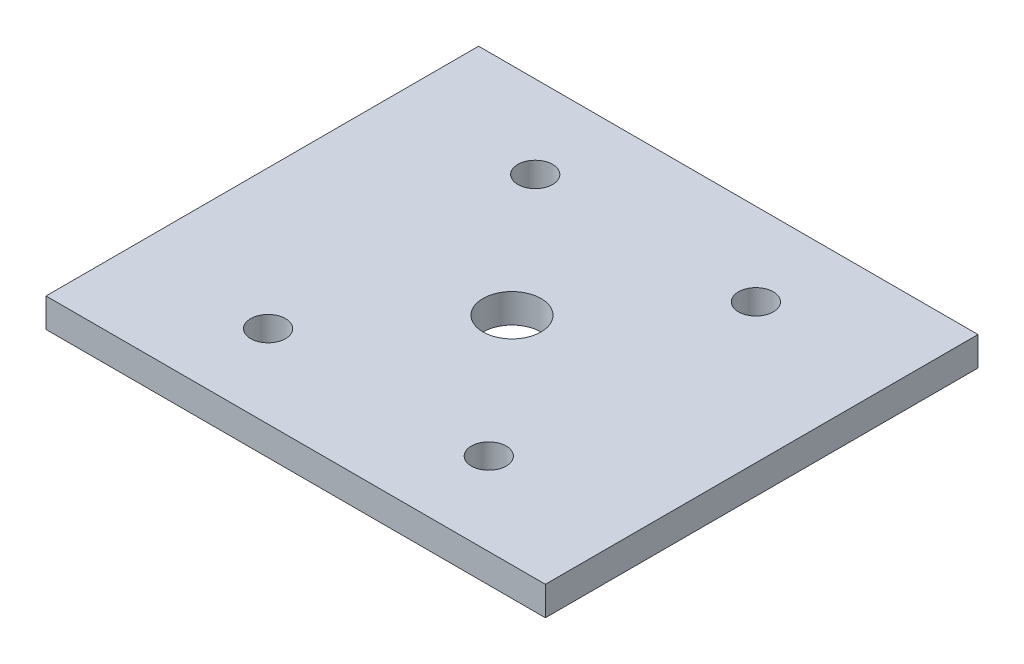
ISO-10303-21;
HEADER;
FILE_DESCRIPTION(('STEP AP214'),'2;1');
FILE_NAME('part.step','',(''),(''),'','','');
FILE_SCHEMA(('AUTOMOTIVE_DESIGN { 1 0 10303 214 1 1 1 1 }'));
ENDSEC;
DATA;
#1=APPLICATION_CONTEXT('core data for automotive mechanical design processes');
#2=APPLICATION_PROTOCOL_DEFINITION('international standard','automotive_design',2000,#1);
#3=PRODUCT_CONTEXT('',#1,'mechanical');
#4=PRODUCT('Part','Part','',(#3));
#5=PRODUCT_RELATED_PRODUCT_CATEGORY('part','',(#4));
#6=PRODUCT_DEFINITION_FORMATION('','',#4);
#7=PRODUCT_DEFINITION_CONTEXT('part definition',#1,'design');
#8=PRODUCT_DEFINITION('design','',#6,#7);
#9=PRODUCT_DEFINITION_SHAPE('','',#8);
#10=(LENGTH_UNIT() NAMED_UNIT(*) SI_UNIT(.MILLI.,.METRE.));
#11=(NAMED_UNIT(*) PLANE_ANGLE_UNIT() SI_UNIT($,.RADIAN.));
#12=(NAMED_UNIT(*) SI_UNIT($,.STERADIAN.) SOLID_ANGLE_UNIT());
#13=UNCERTAINTY_MEASURE_WITH_UNIT(LENGTH_MEASURE(1.E-05),#10,'distance_accuracy_value','');
#14=(GEOMETRIC_REPRESENTATION_CONTEXT(3) GLOBAL_UNCERTAINTY_ASSIGNED_CONTEXT((#13)) GLOBAL_UNIT_ASSIGNED_CONTEXT((#10,
#11,#12)) REPRESENTATION_CONTEXT('',''));
#15=CARTESIAN_POINT('',(0.,0.,0.));
#16=DIRECTION('',(0.,0.,1.));
#17=DIRECTION('',(1.,0.,0.));
#18=AXIS2_PLACEMENT_3D('',#15,#16,#17);
#19=CARTESIAN_POINT('',(0.,-10.,0.));
#20=DIRECTION('',(0.,-1.,0.));
#21=DIRECTION('',(0.,0.,-1.));
#22=AXIS2_PLACEMENT_3D('',#19,#20,#21);
#23=PLANE('',#22);
#24=CARTESIAN_POINT('',(85.0000000000001,-10.,-28.5000000000005));
#25=DIRECTION('',(0.,1.,0.));
#26=DIRECTION('',(0.,0.,1.));
#27=AXIS2_PLACEMENT_3D('',#24,#25,#26);
#28=CIRCLE('',#27,6.);
#29=CARTESIAN_POINT('',(85.0000000000001,-10.,-22.5000000000005));
#30=VERTEX_POINT('',#29);
#31=EDGE_CURVE('E170',#30,#30,#28,.F.);
#32=ORIENTED_EDGE('',*,*,#31,.F.);
#33=EDGE_LOOP('',(#32));
#34=FACE_BOUND('',#33,.T.);
#35=CARTESIAN_POINT('',(9.00000000000013,-10.,-120.5));
#36=DIRECTION('',(0.,1.,0.));
#37=DIRECTION('',(0.,0.,1.));
#38=AXIS2_PLACEMENT_3D('',#35,#36,#37);
#39=CIRCLE('',#38,6.00000000000001);
#40=CARTESIAN_POINT('',(9.00000000000013,-10.,-114.5));
#41=VERTEX_POINT('',#40);
#42=EDGE_CURVE('E113',#41,#41,#39,.F.);
#43=ORIENTED_EDGE('',*,*,#42,.F.);
#44=EDGE_LOOP('',(#43));
#45=FACE_BOUND('',#44,.T.);
#46=DIRECTION('',(0.,0.,1.));
#47=VECTOR('',#46,1.);
#48=CARTESIAN_POINT('',(-38.9999999999999,-10.,-4.71844785465692E-13));
#49=LINE('',#48,#47);
#50=CARTESIAN_POINT('',(-38.9999999999999,-10.,-149.));
#51=VERTEX_POINT('',#50);
#52=CARTESIAN_POINT('',(-38.9999999999999,-10.,-4.71844785465692E-13));
#53=VERTEX_POINT('',#52);
#54=EDGE_CURVE('E102',#51,#53,#49,.T.);
#55=ORIENTED_EDGE('',*,*,#54,.F.);
#56=DIRECTION('',(-1.,0.,0.));
#57=VECTOR('',#56,1.);
#58=CARTESIAN_POINT('',(-38.9999999999999,-10.,-149.));
#59=LINE('',#58,#57);
#60=CARTESIAN_POINT('',(133.,-10.,-149.));
#61=VERTEX_POINT('',#60);
#62=EDGE_CURVE('E99',#61,#51,#59,.T.);
#63=ORIENTED_EDGE('',*,*,#62,.F.);
#64=DIRECTION('',(0.,0.,-1.));
#65=VECTOR('',#64,1.);
#66=CARTESIAN_POINT('',(133.,-10.,-3.60822483003176E-13));
#67=LINE('',#66,#65);
#68=CARTESIAN_POINT('',(133.,-10.,-3.60822483003176E-13));
#69=VERTEX_POINT('',#68);
#70=EDGE_CURVE('E92',#69,#61,#67,.T.);
#71=ORIENTED_EDGE('',*,*,#70,.F.);
#72=DIRECTION('',(1.,0.,0.));
#73=VECTOR('',#72,1.);
#74=CARTESIAN_POINT('',(-38.9999999999999,-10.,-4.71844785465692E-13));
#75=LINE('',#74,#73);
#76=EDGE_CURVE('E98',#53,#69,#75,.T.);
#77=ORIENTED_EDGE('',*,*,#76,.F.);
#78=EDGE_LOOP('',(#55,#63,#71,#77));
#79=FACE_BOUND('',#78,.T.);
#80=CARTESIAN_POINT('',(47.0000000000001,-10.,-74.5000000000004));
#81=DIRECTION('',(0.,1.,0.));
#82=DIRECTION('',(0.,0.,1.));
#83=AXIS2_PLACEMENT_3D('',#80,#81,#82);
#84=CIRCLE('',#83,10.);
#85=CARTESIAN_POINT('',(47.0000000000001,-10.,-64.5000000000004));
#86=VERTEX_POINT('',#85);
#87=EDGE_CURVE('E165',#86,#86,#84,.T.);
#88=ORIENTED_EDGE('',*,*,#87,.T.);
#89=EDGE_LOOP('',(#88));
#90=FACE_BOUND('',#89,.T.);
#91=CARTESIAN_POINT('',(9.0000000000001,-10.,-28.5000000000006));
#92=DIRECTION('',(0.,1.,0.));
#93=DIRECTION('',(0.,0.,1.));
#94=AXIS2_PLACEMENT_3D('',#91,#92,#93);
#95=CIRCLE('',#94,6.);
#96=CARTESIAN_POINT('',(9.0000000000001,-10.,-22.5000000000006));
#97=VERTEX_POINT('',#96);
#98=EDGE_CURVE('E187',#97,#97,#95,.T.);
#99=ORIENTED_EDGE('',*,*,#98,.T.);
#100=EDGE_LOOP('',(#99));
#101=FACE_BOUND('',#100,.T.);
#102=CARTESIAN_POINT('',(85.0000000000001,-10.,-120.5));
#103=DIRECTION('',(0.,1.,0.));
#104=DIRECTION('',(0.,0.,1.));
#105=AXIS2_PLACEMENT_3D('',#102,#103,#104);
#106=CIRCLE('',#105,6.);
#107=CARTESIAN_POINT('',(85.0000000000001,-10.,-114.5));
#108=VERTEX_POINT('',#107);
#109=EDGE_CURVE('E180',#108,#108,#106,.T.);
#110=ORIENTED_EDGE('',*,*,#109,.T.);
#111=EDGE_LOOP('',(#110));
#112=FACE_BOUND('',#111,.T.);
#113=ADVANCED_FACE('F43',(#34,#45,#79,#90,#101,#112),#23,.T.);
#114=CARTESIAN_POINT('',(0.,0.,0.));
#115=DIRECTION('',(0.,-1.,0.));
#116=DIRECTION('',(0.,0.,-1.));
#117=AXIS2_PLACEMENT_3D('',#114,#115,#116);
#118=PLANE('',#117);
#119=CARTESIAN_POINT('',(9.0000000000001,0.,-28.5000000000006));
#120=DIRECTION('',(0.,1.,0.));
#121=DIRECTION('',(0.,0.,1.));
#122=AXIS2_PLACEMENT_3D('',#119,#120,#121);
#123=CIRCLE('',#122,6.);
#124=CARTESIAN_POINT('',(9.0000000000001,0.,-22.5000000000006));
#125=VERTEX_POINT('',#124);
#126=EDGE_CURVE('E172',#125,#125,#123,.T.);
#127=ORIENTED_EDGE('',*,*,#126,.F.);
#128=EDGE_LOOP('',(#127));
#129=FACE_BOUND('',#128,.T.);
#130=DIRECTION('',(0.,0.,1.));
#131=VECTOR('',#130,1.);
#132=CARTESIAN_POINT('',(-38.9999999999999,0.,-4.71844785465692E-13));
#133=LINE('',#132,#131);
#134=CARTESIAN_POINT('',(-38.9999999999999,0.,-149.));
#135=VERTEX_POINT('',#134);
#136=CARTESIAN_POINT('',(-38.9999999999999,0.,-4.71844785465692E-13));
#137=VERTEX_POINT('',#136);
#138=EDGE_CURVE('E109',#135,#137,#133,.T.);
#139=ORIENTED_EDGE('',*,*,#138,.T.);
#140=DIRECTION('',(1.,0.,0.));
#141=VECTOR('',#140,1.);
#142=CARTESIAN_POINT('',(-38.9999999999999,0.,-4.71844785465692E-13));
#143=LINE('',#142,#141);
#144=CARTESIAN_POINT('',(133.,0.,-3.60822483003176E-13));
#145=VERTEX_POINT('',#144);
#146=EDGE_CURVE('E112',#137,#145,#143,.T.);
#147=ORIENTED_EDGE('',*,*,#146,.T.);
#148=DIRECTION('',(0.,0.,-1.));
#149=VECTOR('',#148,1.);
#150=CARTESIAN_POINT('',(133.,0.,-3.60822483003176E-13));
#151=LINE('',#150,#149);
#152=CARTESIAN_POINT('',(133.,0.,-149.));
#153=VERTEX_POINT('',#152);
#154=EDGE_CURVE('E94',#145,#153,#151,.T.);
#155=ORIENTED_EDGE('',*,*,#154,.T.);
#156=DIRECTION('',(-1.,0.,0.));
#157=VECTOR('',#156,1.);
#158=CARTESIAN_POINT('',(-38.9999999999999,0.,-149.));
#159=LINE('',#158,#157);
#160=EDGE_CURVE('E104',#153,#135,#159,.T.);
#161=ORIENTED_EDGE('',*,*,#160,.T.);
#162=EDGE_LOOP('',(#139,#147,#155,#161));
#163=FACE_BOUND('',#162,.T.);
#164=CARTESIAN_POINT('',(9.00000000000013,0.,-120.5));
#165=DIRECTION('',(0.,1.,0.));
#166=DIRECTION('',(0.,0.,1.));
#167=AXIS2_PLACEMENT_3D('',#164,#165,#166);
#168=CIRCLE('',#167,6.00000000000001);
#169=CARTESIAN_POINT('',(9.00000000000013,0.,-114.5));
#170=VERTEX_POINT('',#169);
#171=EDGE_CURVE('E183',#170,#170,#168,.F.);
#172=ORIENTED_EDGE('',*,*,#171,.T.);
#173=EDGE_LOOP('',(#172));
#174=FACE_BOUND('',#173,.T.);
#175=CARTESIAN_POINT('',(85.0000000000001,0.,-28.5000000000005));
#176=DIRECTION('',(0.,1.,0.));
#177=DIRECTION('',(0.,0.,1.));
#178=AXIS2_PLACEMENT_3D('',#175,#176,#177);
#179=CIRCLE('',#178,6.);
#180=CARTESIAN_POINT('',(85.0000000000001,0.,-22.5000000000005));
#181=VERTEX_POINT('',#180);
#182=EDGE_CURVE('E175',#181,#181,#179,.F.);
#183=ORIENTED_EDGE('',*,*,#182,.T.);
#184=EDGE_LOOP('',(#183));
#185=FACE_BOUND('',#184,.T.);
#186=CARTESIAN_POINT('',(47.0000000000001,0.,-74.5000000000004));
#187=DIRECTION('',(0.,1.,0.));
#188=DIRECTION('',(0.,0.,1.));
#189=AXIS2_PLACEMENT_3D('',#186,#187,#188);
#190=CIRCLE('',#189,10.);
#191=CARTESIAN_POINT('',(47.0000000000001,0.,-64.5000000000004));
#192=VERTEX_POINT('',#191);
#193=EDGE_CURVE('E168',#192,#192,#190,.T.);
#194=ORIENTED_EDGE('',*,*,#193,.F.);
#195=EDGE_LOOP('',(#194));
#196=FACE_BOUND('',#195,.T.);
#197=CARTESIAN_POINT('',(85.0000000000001,0.,-120.5));
#198=DIRECTION('',(0.,1.,0.));
#199=DIRECTION('',(0.,0.,1.));
#200=AXIS2_PLACEMENT_3D('',#197,#198,#199);
#201=CIRCLE('',#200,6.);
#202=CARTESIAN_POINT('',(85.0000000000001,0.,-114.5));
#203=VERTEX_POINT('',#202);
#204=EDGE_CURVE('E184',#203,#203,#201,.T.);
#205=ORIENTED_EDGE('',*,*,#204,.F.);
#206=EDGE_LOOP('',(#205));
#207=FACE_BOUND('',#206,.T.);
#208=ADVANCED_FACE('F119',(#129,#163,#174,#185,#196,#207),#118,.F.);
#209=CARTESIAN_POINT('',(-38.9999999999999,-10.,-4.71844785465692E-13));
#210=DIRECTION('',(-1.,0.,0.));
#211=DIRECTION('',(0.,0.,1.));
#212=AXIS2_PLACEMENT_3D('',#209,#210,#211);
#213=PLANE('',#212);
#214=ORIENTED_EDGE('',*,*,#138,.F.);
#215=DIRECTION('',(0.,1.,0.));
#216=VECTOR('',#215,1.);
#217=CARTESIAN_POINT('',(-38.9999999999999,-10.,-149.));
#218=LINE('',#217,#216);
#219=EDGE_CURVE('E11',#51,#135,#218,.T.);
#220=ORIENTED_EDGE('',*,*,#219,.F.);
#221=ORIENTED_EDGE('',*,*,#54,.T.);
#222=DIRECTION('',(0.,1.,0.));
#223=VECTOR('',#222,1.);
#224=CARTESIAN_POINT('',(-38.9999999999999,-10.,-4.71844785465692E-13));
#225=LINE('',#224,#223);
#226=EDGE_CURVE('E47',#53,#137,#225,.T.);
#227=ORIENTED_EDGE('',*,*,#226,.T.);
#228=EDGE_LOOP('',(#214,#220,#221,#227));
#229=FACE_BOUND('',#228,.T.);
#230=ADVANCED_FACE('F45',(#229),#213,.T.);
#231=CARTESIAN_POINT('',(-38.9999999999999,-10.,-149.));
#232=DIRECTION('',(0.,0.,-1.));
#233=DIRECTION('',(-1.,0.,0.));
#234=AXIS2_PLACEMENT_3D('',#231,#232,#233);
#235=PLANE('',#234);
#236=ORIENTED_EDGE('',*,*,#160,.F.);
#237=DIRECTION('',(0.,1.,0.));
#238=VECTOR('',#237,1.);
#239=CARTESIAN_POINT('',(133.,-10.,-149.));
#240=LINE('',#239,#238);
#241=EDGE_CURVE('E53',#61,#153,#240,.T.);
#242=ORIENTED_EDGE('',*,*,#241,.F.);
#243=ORIENTED_EDGE('',*,*,#62,.T.);
#244=ORIENTED_EDGE('',*,*,#219,.T.);
#245=EDGE_LOOP('',(#236,#242,#243,#244));
#246=FACE_BOUND('',#245,.T.);
#247=ADVANCED_FACE('F121',(#246),#235,.T.);
#248=CARTESIAN_POINT('',(133.,-10.,-3.60822483003176E-13));
#249=DIRECTION('',(1.,0.,0.));
#250=DIRECTION('',(0.,0.,-1.));
#251=AXIS2_PLACEMENT_3D('',#248,#249,#250);
#252=PLANE('',#251);
#253=ORIENTED_EDGE('',*,*,#154,.F.);
#254=DIRECTION('',(0.,1.,0.));
#255=VECTOR('',#254,1.);
#256=CARTESIAN_POINT('',(133.,-10.,-3.60822483003176E-13));
#257=LINE('',#256,#255);
#258=EDGE_CURVE('E89',#69,#145,#257,.T.);
#259=ORIENTED_EDGE('',*,*,#258,.F.);
#260=ORIENTED_EDGE('',*,*,#70,.T.);
#261=ORIENTED_EDGE('',*,*,#241,.T.);
#262=EDGE_LOOP('',(#253,#259,#260,#261));
#263=FACE_BOUND('',#262,.T.);
#264=ADVANCED_FACE('F91',(#263),#252,.T.);
#265=CARTESIAN_POINT('',(-38.9999999999999,-10.,-4.71844785465692E-13));
#266=DIRECTION('',(0.,0.,1.));
#267=DIRECTION('',(1.,0.,0.));
#268=AXIS2_PLACEMENT_3D('',#265,#266,#267);
#269=PLANE('',#268);
#270=ORIENTED_EDGE('',*,*,#146,.F.);
#271=ORIENTED_EDGE('',*,*,#226,.F.);
#272=ORIENTED_EDGE('',*,*,#76,.T.);
#273=ORIENTED_EDGE('',*,*,#258,.T.);
#274=EDGE_LOOP('',(#270,#271,#272,#273));
#275=FACE_BOUND('',#274,.T.);
#276=ADVANCED_FACE('F101',(#275),#269,.T.);
#277=CARTESIAN_POINT('',(9.00000000000013,-10.,-120.5));
#278=DIRECTION('',(0.,1.,0.));
#279=DIRECTION('',(0.,0.,1.));
#280=AXIS2_PLACEMENT_3D('',#277,#278,#279);
#281=CYLINDRICAL_SURFACE('',#280,6.00000000000001);
#282=ORIENTED_EDGE('',*,*,#42,.T.);
#283=EDGE_LOOP('',(#282));
#284=FACE_BOUND('',#283,.T.);
#285=ORIENTED_EDGE('',*,*,#171,.F.);
#286=EDGE_LOOP('',(#285));
#287=FACE_BOUND('',#286,.T.);
#288=ADVANCED_FACE('F141',(#284,#287),#281,.F.);
#289=CARTESIAN_POINT('',(85.0000000000001,-10.,-28.5000000000005));
#290=DIRECTION('',(0.,1.,0.));
#291=DIRECTION('',(0.,0.,1.));
#292=AXIS2_PLACEMENT_3D('',#289,#290,#291);
#293=CYLINDRICAL_SURFACE('',#292,6.);
#294=ORIENTED_EDGE('',*,*,#31,.T.);
#295=EDGE_LOOP('',(#294));
#296=FACE_BOUND('',#295,.T.);
#297=ORIENTED_EDGE('',*,*,#182,.F.);
#298=EDGE_LOOP('',(#297));
#299=FACE_BOUND('',#298,.T.);
#300=ADVANCED_FACE('F144',(#296,#299),#293,.F.);
#301=CARTESIAN_POINT('',(47.0000000000001,-10.,-74.5000000000004));
#302=DIRECTION('',(0.,1.,0.));
#303=DIRECTION('',(0.,0.,1.));
#304=AXIS2_PLACEMENT_3D('',#301,#302,#303);
#305=CYLINDRICAL_SURFACE('',#304,10.);
#306=ORIENTED_EDGE('',*,*,#87,.F.);
#307=EDGE_LOOP('',(#306));
#308=FACE_BOUND('',#307,.T.);
#309=ORIENTED_EDGE('',*,*,#193,.T.);
#310=EDGE_LOOP('',(#309));
#311=FACE_BOUND('',#310,.T.);
#312=ADVANCED_FACE('F150',(#308,#311),#305,.F.);
#313=CARTESIAN_POINT('',(9.0000000000001,-10.,-28.5000000000006));
#314=DIRECTION('',(0.,1.,0.));
#315=DIRECTION('',(0.,0.,1.));
#316=AXIS2_PLACEMENT_3D('',#313,#314,#315);
#317=CYLINDRICAL_SURFACE('',#316,6.);
#318=ORIENTED_EDGE('',*,*,#98,.F.);
#319=EDGE_LOOP('',(#318));
#320=FACE_BOUND('',#319,.T.);
#321=ORIENTED_EDGE('',*,*,#126,.T.);
#322=EDGE_LOOP('',(#321));
#323=FACE_BOUND('',#322,.T.);
#324=ADVANCED_FACE('F146',(#320,#323),#317,.F.);
#325=CARTESIAN_POINT('',(85.0000000000001,-10.,-120.5));
#326=DIRECTION('',(0.,1.,0.));
#327=DIRECTION('',(0.,0.,1.));
#328=AXIS2_PLACEMENT_3D('',#325,#326,#327);
#329=CYLINDRICAL_SURFACE('',#328,6.);
#330=ORIENTED_EDGE('',*,*,#109,.F.);
#331=EDGE_LOOP('',(#330));
#332=FACE_BOUND('',#331,.T.);
#333=ORIENTED_EDGE('',*,*,#204,.T.);
#334=EDGE_LOOP('',(#333));
#335=FACE_BOUND('',#334,.T.);
#336=ADVANCED_FACE('F149',(#332,#335),#329,.F.);
#337=CLOSED_SHELL('',(#113,#208,#230,#247,#264,#276,#288,#300,#312,#324,#336));
#338=MANIFOLD_SOLID_BREP('B2',#337);
#339=ADVANCED_BREP_SHAPE_REPRESENTATION('',(#18,#338),#14);
#340=SHAPE_DEFINITION_REPRESENTATION(#9,#339);
ENDSEC;
END-ISO-10303-21;
